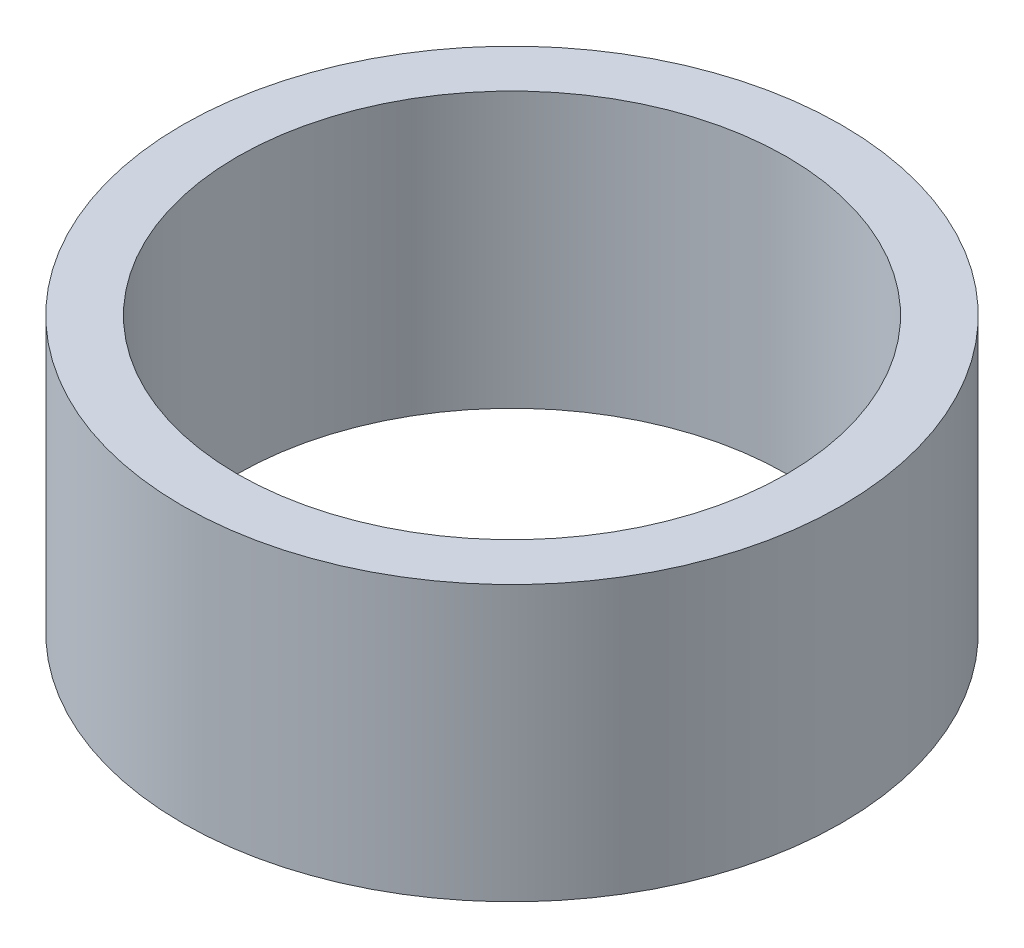
ISO-10303-21;
HEADER;
FILE_DESCRIPTION(('STEP AP214'),'2;1');
FILE_NAME('part.step','',(''),(''),'','','');
FILE_SCHEMA(('AUTOMOTIVE_DESIGN { 1 0 10303 214 1 1 1 1 }'));
ENDSEC;
DATA;
#1=APPLICATION_CONTEXT('core data for automotive mechanical design processes');
#2=APPLICATION_PROTOCOL_DEFINITION('international standard','automotive_design',2000,#1);
#3=PRODUCT_CONTEXT('',#1,'mechanical');
#4=PRODUCT('Part','Part','',(#3));
#5=PRODUCT_RELATED_PRODUCT_CATEGORY('part','',(#4));
#6=PRODUCT_DEFINITION_FORMATION('','',#4);
#7=PRODUCT_DEFINITION_CONTEXT('part definition',#1,'design');
#8=PRODUCT_DEFINITION('design','',#6,#7);
#9=PRODUCT_DEFINITION_SHAPE('','',#8);
#10=(LENGTH_UNIT() NAMED_UNIT(*) SI_UNIT(.MILLI.,.METRE.));
#11=(NAMED_UNIT(*) PLANE_ANGLE_UNIT() SI_UNIT($,.RADIAN.));
#12=(NAMED_UNIT(*) SI_UNIT($,.STERADIAN.) SOLID_ANGLE_UNIT());
#13=UNCERTAINTY_MEASURE_WITH_UNIT(LENGTH_MEASURE(1.E-05),#10,'distance_accuracy_value','');
#14=(GEOMETRIC_REPRESENTATION_CONTEXT(3) GLOBAL_UNCERTAINTY_ASSIGNED_CONTEXT((#13)) GLOBAL_UNIT_ASSIGNED_CONTEXT((#10,
#11,#12)) REPRESENTATION_CONTEXT('',''));
#15=CARTESIAN_POINT('',(0.,0.,0.));
#16=DIRECTION('',(0.,0.,1.));
#17=DIRECTION('',(1.,0.,0.));
#18=AXIS2_PLACEMENT_3D('',#15,#16,#17);
#19=CARTESIAN_POINT('',(-2.12955638156679,5.,-0.831402148967857));
#20=DIRECTION('',(0.,1.,0.));
#21=DIRECTION('',(0.,0.,1.));
#22=AXIS2_PLACEMENT_3D('',#19,#20,#21);
#23=PLANE('',#22);
#24=CARTESIAN_POINT('',(-2.12955638156679,5.,-0.831402148967857));
#25=DIRECTION('',(0.,1.,0.));
#26=DIRECTION('',(0.,0.,1.));
#27=AXIS2_PLACEMENT_3D('',#24,#25,#26);
#28=CIRCLE('',#27,6.);
#29=CARTESIAN_POINT('',(-2.12955638156679,5.,5.16859785103214));
#30=VERTEX_POINT('',#29);
#31=EDGE_CURVE('E10',#30,#30,#28,.T.);
#32=ORIENTED_EDGE('',*,*,#31,.T.);
#33=EDGE_LOOP('',(#32));
#34=FACE_BOUND('',#33,.T.);
#35=CARTESIAN_POINT('',(-2.12955638156679,5.,-0.831402148967857));
#36=DIRECTION('',(0.,1.,0.));
#37=DIRECTION('',(0.,0.,1.));
#38=AXIS2_PLACEMENT_3D('',#35,#36,#37);
#39=CIRCLE('',#38,5.);
#40=CARTESIAN_POINT('',(-2.12955638156679,5.,4.16859785103214));
#41=VERTEX_POINT('',#40);
#42=EDGE_CURVE('E44',#41,#41,#39,.T.);
#43=ORIENTED_EDGE('',*,*,#42,.F.);
#44=EDGE_LOOP('',(#43));
#45=FACE_BOUND('',#44,.T.);
#46=ADVANCED_FACE('F33',(#34,#45),#23,.T.);
#47=CARTESIAN_POINT('',(-2.12955638156679,0.,-0.831402148967857));
#48=DIRECTION('',(0.,1.,0.));
#49=DIRECTION('',(0.,0.,1.));
#50=AXIS2_PLACEMENT_3D('',#47,#48,#49);
#51=PLANE('',#50);
#52=CARTESIAN_POINT('',(-2.12955638156679,0.,-0.831402148967857));
#53=DIRECTION('',(0.,1.,0.));
#54=DIRECTION('',(0.,0.,1.));
#55=AXIS2_PLACEMENT_3D('',#52,#53,#54);
#56=CIRCLE('',#55,6.);
#57=CARTESIAN_POINT('',(-2.12955638156679,0.,5.16859785103214));
#58=VERTEX_POINT('',#57);
#59=EDGE_CURVE('E37',#58,#58,#56,.T.);
#60=ORIENTED_EDGE('',*,*,#59,.F.);
#61=EDGE_LOOP('',(#60));
#62=FACE_BOUND('',#61,.T.);
#63=CARTESIAN_POINT('',(-2.12955638156679,0.,-0.831402148967857));
#64=DIRECTION('',(0.,1.,0.));
#65=DIRECTION('',(0.,0.,1.));
#66=AXIS2_PLACEMENT_3D('',#63,#64,#65);
#67=CIRCLE('',#66,5.);
#68=CARTESIAN_POINT('',(-2.12955638156679,0.,4.16859785103214));
#69=VERTEX_POINT('',#68);
#70=EDGE_CURVE('E46',#69,#69,#67,.T.);
#71=ORIENTED_EDGE('',*,*,#70,.T.);
#72=EDGE_LOOP('',(#71));
#73=FACE_BOUND('',#72,.T.);
#74=ADVANCED_FACE('F56',(#62,#73),#51,.F.);
#75=CARTESIAN_POINT('',(-2.12955638156679,5.,-0.831402148967857));
#76=DIRECTION('',(0.,-1.,0.));
#77=DIRECTION('',(0.,0.,-1.));
#78=AXIS2_PLACEMENT_3D('',#75,#76,#77);
#79=CYLINDRICAL_SURFACE('',#78,6.);
#80=ORIENTED_EDGE('',*,*,#31,.F.);
#81=EDGE_LOOP('',(#80));
#82=FACE_BOUND('',#81,.T.);
#83=ORIENTED_EDGE('',*,*,#59,.T.);
#84=EDGE_LOOP('',(#83));
#85=FACE_BOUND('',#84,.T.);
#86=ADVANCED_FACE('F35',(#82,#85),#79,.T.);
#87=CARTESIAN_POINT('',(-2.12955638156679,5.,-0.831402148967857));
#88=DIRECTION('',(0.,-1.,0.));
#89=DIRECTION('',(0.,0.,-1.));
#90=AXIS2_PLACEMENT_3D('',#87,#88,#89);
#91=CYLINDRICAL_SURFACE('',#90,5.);
#92=ORIENTED_EDGE('',*,*,#42,.T.);
#93=EDGE_LOOP('',(#92));
#94=FACE_BOUND('',#93,.T.);
#95=ORIENTED_EDGE('',*,*,#70,.F.);
#96=EDGE_LOOP('',(#95));
#97=FACE_BOUND('',#96,.T.);
#98=ADVANCED_FACE('F52',(#94,#97),#91,.F.);
#99=CLOSED_SHELL('',(#46,#74,#86,#98));
#100=MANIFOLD_SOLID_BREP('B2',#99);
#101=ADVANCED_BREP_SHAPE_REPRESENTATION('',(#18,#100),#14);
#102=SHAPE_DEFINITION_REPRESENTATION(#9,#101);
ENDSEC;
END-ISO-10303-21;
